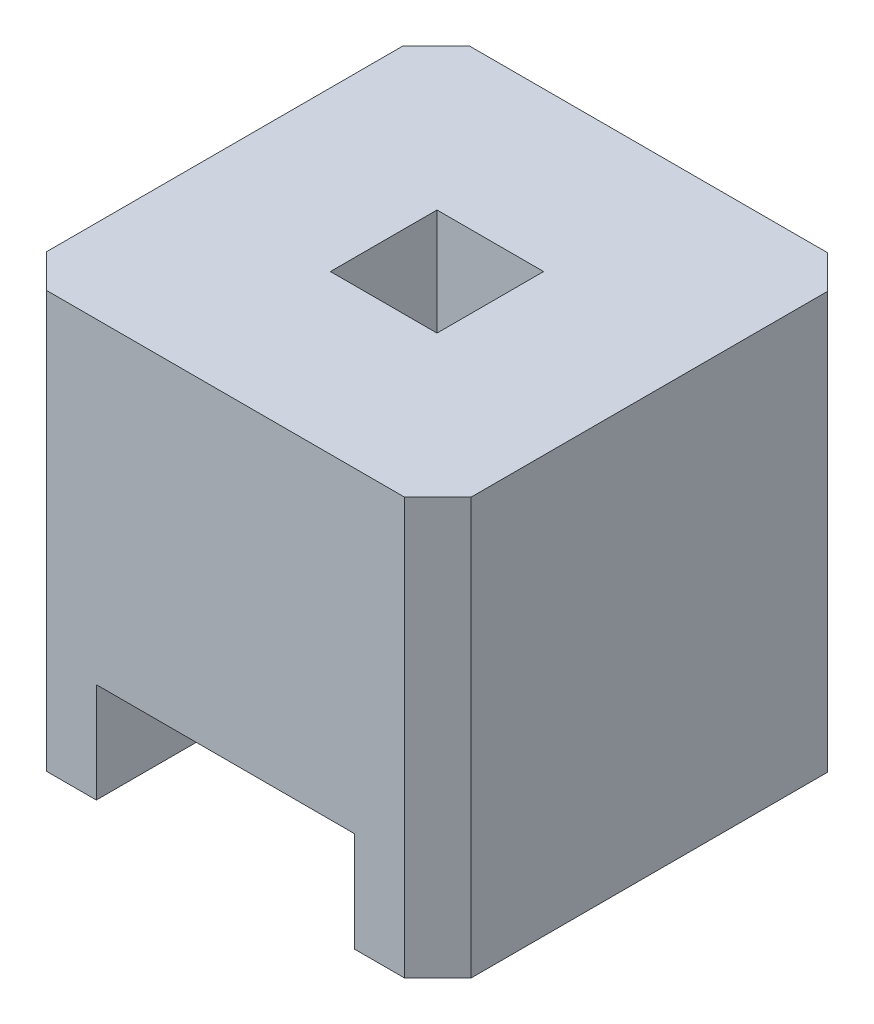
ISO-10303-21;
HEADER;
FILE_DESCRIPTION(('STEP AP214'),'2;1');
FILE_NAME('part.step','',(''),(''),'','','');
FILE_SCHEMA(('AUTOMOTIVE_DESIGN { 1 0 10303 214 1 1 1 1 }'));
ENDSEC;
DATA;
#1=APPLICATION_CONTEXT('core data for automotive mechanical design processes');
#2=APPLICATION_PROTOCOL_DEFINITION('international standard','automotive_design',2000,#1);
#3=PRODUCT_CONTEXT('',#1,'mechanical');
#4=PRODUCT('Part','Part','',(#3));
#5=PRODUCT_RELATED_PRODUCT_CATEGORY('part','',(#4));
#6=PRODUCT_DEFINITION_FORMATION('','',#4);
#7=PRODUCT_DEFINITION_CONTEXT('part definition',#1,'design');
#8=PRODUCT_DEFINITION('design','',#6,#7);
#9=PRODUCT_DEFINITION_SHAPE('','',#8);
#10=(LENGTH_UNIT() NAMED_UNIT(*) SI_UNIT(.MILLI.,.METRE.));
#11=(NAMED_UNIT(*) PLANE_ANGLE_UNIT() SI_UNIT($,.RADIAN.));
#12=(NAMED_UNIT(*) SI_UNIT($,.STERADIAN.) SOLID_ANGLE_UNIT());
#13=UNCERTAINTY_MEASURE_WITH_UNIT(LENGTH_MEASURE(1.E-05),#10,'distance_accuracy_value','');
#14=(GEOMETRIC_REPRESENTATION_CONTEXT(3) GLOBAL_UNCERTAINTY_ASSIGNED_CONTEXT((#13)) GLOBAL_UNIT_ASSIGNED_CONTEXT((#10,
#11,#12)) REPRESENTATION_CONTEXT('',''));
#15=CARTESIAN_POINT('',(0.,0.,0.));
#16=DIRECTION('',(0.,0.,1.));
#17=DIRECTION('',(1.,0.,0.));
#18=AXIS2_PLACEMENT_3D('',#15,#16,#17);
#19=CARTESIAN_POINT('',(0.32,1.25,0.32));
#20=DIRECTION('',(0.,0.,1.));
#21=DIRECTION('',(1.,0.,0.));
#22=AXIS2_PLACEMENT_3D('',#19,#20,#21);
#23=PLANE('',#22);
#24=DIRECTION('',(0.,-1.,0.));
#25=VECTOR('',#24,1.);
#26=CARTESIAN_POINT('',(-0.32,1.25,0.32));
#27=LINE('',#26,#25);
#28=CARTESIAN_POINT('',(-0.32,-0.65,0.32));
#29=VERTEX_POINT('',#28);
#30=CARTESIAN_POINT('',(-0.32,1.25,0.32));
#31=VERTEX_POINT('',#30);
#32=EDGE_CURVE('E171',#29,#31,#27,.F.);
#33=ORIENTED_EDGE('',*,*,#32,.T.);
#34=DIRECTION('',(1.,0.,0.));
#35=VECTOR('',#34,1.);
#36=CARTESIAN_POINT('',(0.32,1.25,0.32));
#37=LINE('',#36,#35);
#38=CARTESIAN_POINT('',(0.32,1.25,0.32));
#39=VERTEX_POINT('',#38);
#40=EDGE_CURVE('E20',#39,#31,#37,.F.);
#41=ORIENTED_EDGE('',*,*,#40,.F.);
#42=DIRECTION('',(0.,1.,0.));
#43=VECTOR('',#42,1.);
#44=CARTESIAN_POINT('',(0.32,1.25,0.32));
#45=LINE('',#44,#43);
#46=CARTESIAN_POINT('',(0.32,-0.65,0.32));
#47=VERTEX_POINT('',#46);
#48=EDGE_CURVE('E180',#39,#47,#45,.F.);
#49=ORIENTED_EDGE('',*,*,#48,.T.);
#50=DIRECTION('',(1.,0.,0.));
#51=VECTOR('',#50,1.);
#52=CARTESIAN_POINT('',(0.32,-0.65,0.32));
#53=LINE('',#52,#51);
#54=EDGE_CURVE('E158',#29,#47,#53,.T.);
#55=ORIENTED_EDGE('',*,*,#54,.F.);
#56=EDGE_LOOP('',(#33,#41,#49,#55));
#57=FACE_BOUND('',#56,.T.);
#58=ADVANCED_FACE('F17',(#57),#23,.F.);
#59=CARTESIAN_POINT('',(0.775,-0.65,0.));
#60=DIRECTION('',(-1.,0.,0.));
#61=DIRECTION('',(0.,0.,1.));
#62=AXIS2_PLACEMENT_3D('',#59,#60,#61);
#63=PLANE('',#62);
#64=DIRECTION('',(0.,0.,1.));
#65=VECTOR('',#64,1.);
#66=CARTESIAN_POINT('',(0.775,-0.65,0.));
#67=LINE('',#66,#65);
#68=CARTESIAN_POINT('',(0.775,-0.65,-1.27));
#69=VERTEX_POINT('',#68);
#70=CARTESIAN_POINT('',(0.775,-0.65,1.27));
#71=VERTEX_POINT('',#70);
#72=EDGE_CURVE('E238',#69,#71,#67,.T.);
#73=ORIENTED_EDGE('',*,*,#72,.F.);
#74=DIRECTION('',(0.,1.,0.));
#75=VECTOR('',#74,1.);
#76=CARTESIAN_POINT('',(0.775,-0.65,-1.27));
#77=LINE('',#76,#75);
#78=CARTESIAN_POINT('',(0.775,-1.25,-1.27));
#79=VERTEX_POINT('',#78);
#80=EDGE_CURVE('E155',#69,#79,#77,.F.);
#81=ORIENTED_EDGE('',*,*,#80,.T.);
#82=DIRECTION('',(0.,0.,-1.));
#83=VECTOR('',#82,1.);
#84=CARTESIAN_POINT('',(0.775,-1.25,0.));
#85=LINE('',#84,#83);
#86=CARTESIAN_POINT('',(0.775,-1.25,1.27));
#87=VERTEX_POINT('',#86);
#88=EDGE_CURVE('E193',#87,#79,#85,.T.);
#89=ORIENTED_EDGE('',*,*,#88,.F.);
#90=DIRECTION('',(0.,1.,0.));
#91=VECTOR('',#90,1.);
#92=CARTESIAN_POINT('',(0.775,-0.65,1.27));
#93=LINE('',#92,#91);
#94=EDGE_CURVE('E157',#87,#71,#93,.T.);
#95=ORIENTED_EDGE('',*,*,#94,.T.);
#96=EDGE_LOOP('',(#73,#81,#89,#95));
#97=FACE_BOUND('',#96,.T.);
#98=ADVANCED_FACE('F329',(#97),#63,.T.);
#99=CARTESIAN_POINT('',(-0.775,-1.25,0.));
#100=DIRECTION('',(1.,0.,0.));
#101=DIRECTION('',(0.,1.,0.));
#102=AXIS2_PLACEMENT_3D('',#99,#100,#101);
#103=PLANE('',#102);
#104=DIRECTION('',(0.,0.,-1.));
#105=VECTOR('',#104,1.);
#106=CARTESIAN_POINT('',(-0.775,-1.25,0.));
#107=LINE('',#106,#105);
#108=CARTESIAN_POINT('',(-0.775,-1.25,-1.27));
#109=VERTEX_POINT('',#108);
#110=CARTESIAN_POINT('',(-0.775,-1.25,1.27));
#111=VERTEX_POINT('',#110);
#112=EDGE_CURVE('E142',#109,#111,#107,.F.);
#113=ORIENTED_EDGE('',*,*,#112,.F.);
#114=DIRECTION('',(0.,1.,0.));
#115=VECTOR('',#114,1.);
#116=CARTESIAN_POINT('',(-0.775,-1.25,-1.27));
#117=LINE('',#116,#115);
#118=CARTESIAN_POINT('',(-0.775,-0.65,-1.27));
#119=VERTEX_POINT('',#118);
#120=EDGE_CURVE('E131',#109,#119,#117,.T.);
#121=ORIENTED_EDGE('',*,*,#120,.T.);
#122=DIRECTION('',(0.,0.,1.));
#123=VECTOR('',#122,1.);
#124=CARTESIAN_POINT('',(-0.775,-0.65,0.));
#125=LINE('',#124,#123);
#126=CARTESIAN_POINT('',(-0.775,-0.65,1.27));
#127=VERTEX_POINT('',#126);
#128=EDGE_CURVE('E236',#127,#119,#125,.F.);
#129=ORIENTED_EDGE('',*,*,#128,.F.);
#130=DIRECTION('',(0.,1.,0.));
#131=VECTOR('',#130,1.);
#132=CARTESIAN_POINT('',(-0.775,-1.25,1.27));
#133=LINE('',#132,#131);
#134=EDGE_CURVE('E126',#127,#111,#133,.F.);
#135=ORIENTED_EDGE('',*,*,#134,.T.);
#136=EDGE_LOOP('',(#113,#121,#129,#135));
#137=FACE_BOUND('',#136,.T.);
#138=ADVANCED_FACE('F143',(#137),#103,.T.);
#139=CARTESIAN_POINT('',(-1.275,-1.25,0.));
#140=DIRECTION('',(0.,-1.,0.));
#141=DIRECTION('',(0.,0.,-1.));
#142=AXIS2_PLACEMENT_3D('',#139,#140,#141);
#143=PLANE('',#142);
#144=DIRECTION('',(0.707106781186548,0.,0.707106781186548));
#145=VECTOR('',#144,1.);
#146=CARTESIAN_POINT('',(-1.175,-1.25,1.17));
#147=LINE('',#146,#145);
#148=CARTESIAN_POINT('',(-1.275,-1.25,1.07));
#149=VERTEX_POINT('',#148);
#150=CARTESIAN_POINT('',(-1.075,-1.25,1.27));
#151=VERTEX_POINT('',#150);
#152=EDGE_CURVE('E202',#149,#151,#147,.T.);
#153=ORIENTED_EDGE('',*,*,#152,.F.);
#154=DIRECTION('',(0.,0.,1.));
#155=VECTOR('',#154,1.);
#156=CARTESIAN_POINT('',(-1.275,-1.25,0.));
#157=LINE('',#156,#155);
#158=CARTESIAN_POINT('',(-1.275,-1.25,-1.07));
#159=VERTEX_POINT('',#158);
#160=EDGE_CURVE('E224',#159,#149,#157,.T.);
#161=ORIENTED_EDGE('',*,*,#160,.F.);
#162=DIRECTION('',(-0.707106781186548,0.,0.707106781186548));
#163=VECTOR('',#162,1.);
#164=CARTESIAN_POINT('',(-1.175,-1.25,-1.17));
#165=LINE('',#164,#163);
#166=CARTESIAN_POINT('',(-1.075,-1.25,-1.27));
#167=VERTEX_POINT('',#166);
#168=EDGE_CURVE('E149',#167,#159,#165,.T.);
#169=ORIENTED_EDGE('',*,*,#168,.F.);
#170=DIRECTION('',(1.,0.,0.));
#171=VECTOR('',#170,1.);
#172=CARTESIAN_POINT('',(-1.275,-1.25,-1.27));
#173=LINE('',#172,#171);
#174=EDGE_CURVE('E135',#167,#109,#173,.T.);
#175=ORIENTED_EDGE('',*,*,#174,.T.);
#176=ORIENTED_EDGE('',*,*,#112,.T.);
#177=DIRECTION('',(1.,0.,0.));
#178=VECTOR('',#177,1.);
#179=CARTESIAN_POINT('',(-1.275,-1.25,1.27));
#180=LINE('',#179,#178);
#181=EDGE_CURVE('E145',#111,#151,#180,.F.);
#182=ORIENTED_EDGE('',*,*,#181,.T.);
#183=EDGE_LOOP('',(#153,#161,#169,#175,#176,#182));
#184=FACE_BOUND('',#183,.T.);
#185=ADVANCED_FACE('F147',(#184),#143,.T.);
#186=CARTESIAN_POINT('',(-1.175,0.625,1.17));
#187=DIRECTION('',(-0.707106781186548,0.,0.707106781186548));
#188=DIRECTION('',(0.707106781186548,0.,0.707106781186548));
#189=AXIS2_PLACEMENT_3D('',#186,#187,#188);
#190=PLANE('',#189);
#191=DIRECTION('',(0.707106781186548,0.,0.707106781186548));
#192=VECTOR('',#191,1.);
#193=CARTESIAN_POINT('',(-1.175,1.25,1.17));
#194=LINE('',#193,#192);
#195=CARTESIAN_POINT('',(-1.075,1.25,1.27));
#196=VERTEX_POINT('',#195);
#197=CARTESIAN_POINT('',(-1.275,1.25,1.07));
#198=VERTEX_POINT('',#197);
#199=EDGE_CURVE('E200',#196,#198,#194,.F.);
#200=ORIENTED_EDGE('',*,*,#199,.T.);
#201=DIRECTION('',(0.,1.,0.));
#202=VECTOR('',#201,1.);
#203=CARTESIAN_POINT('',(-1.275,1.25,1.07));
#204=LINE('',#203,#202);
#205=EDGE_CURVE('E213',#149,#198,#204,.T.);
#206=ORIENTED_EDGE('',*,*,#205,.F.);
#207=ORIENTED_EDGE('',*,*,#152,.T.);
#208=DIRECTION('',(0.,1.,0.));
#209=VECTOR('',#208,1.);
#210=CARTESIAN_POINT('',(-1.075,0.,1.27));
#211=LINE('',#210,#209);
#212=EDGE_CURVE('E210',#196,#151,#211,.F.);
#213=ORIENTED_EDGE('',*,*,#212,.F.);
#214=EDGE_LOOP('',(#200,#206,#207,#213));
#215=FACE_BOUND('',#214,.T.);
#216=ADVANCED_FACE('F209',(#215),#190,.T.);
#217=CARTESIAN_POINT('',(1.175,-0.625,1.17));
#218=DIRECTION('',(0.707106781186548,0.,0.707106781186547));
#219=DIRECTION('',(0.707106781186547,0.,-0.707106781186548));
#220=AXIS2_PLACEMENT_3D('',#217,#218,#219);
#221=PLANE('',#220);
#222=DIRECTION('',(-0.707106781186548,0.,0.707106781186548));
#223=VECTOR('',#222,1.);
#224=CARTESIAN_POINT('',(1.275,-1.25,1.07));
#225=LINE('',#224,#223);
#226=CARTESIAN_POINT('',(1.275,-1.25,1.07));
#227=VERTEX_POINT('',#226);
#228=CARTESIAN_POINT('',(1.075,-1.25,1.27));
#229=VERTEX_POINT('',#228);
#230=EDGE_CURVE('E196',#227,#229,#225,.T.);
#231=ORIENTED_EDGE('',*,*,#230,.F.);
#232=DIRECTION('',(0.,1.,0.));
#233=VECTOR('',#232,1.);
#234=CARTESIAN_POINT('',(1.275,-1.25,1.07));
#235=LINE('',#234,#233);
#236=CARTESIAN_POINT('',(1.275,1.25,1.07));
#237=VERTEX_POINT('',#236);
#238=EDGE_CURVE('E269',#237,#227,#235,.F.);
#239=ORIENTED_EDGE('',*,*,#238,.F.);
#240=DIRECTION('',(0.707106781186547,0.,-0.707106781186548));
#241=VECTOR('',#240,1.);
#242=CARTESIAN_POINT('',(1.175,1.25,1.17));
#243=LINE('',#242,#241);
#244=CARTESIAN_POINT('',(1.075,1.25,1.27));
#245=VERTEX_POINT('',#244);
#246=EDGE_CURVE('E198',#237,#245,#243,.F.);
#247=ORIENTED_EDGE('',*,*,#246,.T.);
#248=DIRECTION('',(0.,1.,0.));
#249=VECTOR('',#248,1.);
#250=CARTESIAN_POINT('',(1.075,0.,1.27));
#251=LINE('',#250,#249);
#252=EDGE_CURVE('E275',#229,#245,#251,.T.);
#253=ORIENTED_EDGE('',*,*,#252,.F.);
#254=EDGE_LOOP('',(#231,#239,#247,#253));
#255=FACE_BOUND('',#254,.T.);
#256=ADVANCED_FACE('F285',(#255),#221,.T.);
#257=CARTESIAN_POINT('',(0.775,-1.25,0.));
#258=DIRECTION('',(0.,-1.,0.));
#259=DIRECTION('',(0.,0.,-1.));
#260=AXIS2_PLACEMENT_3D('',#257,#258,#259);
#261=PLANE('',#260);
#262=ORIENTED_EDGE('',*,*,#88,.T.);
#263=DIRECTION('',(1.,0.,0.));
#264=VECTOR('',#263,1.);
#265=CARTESIAN_POINT('',(0.775,-1.25,-1.27));
#266=LINE('',#265,#264);
#267=CARTESIAN_POINT('',(1.075,-1.25,-1.27));
#268=VERTEX_POINT('',#267);
#269=EDGE_CURVE('E191',#79,#268,#266,.T.);
#270=ORIENTED_EDGE('',*,*,#269,.T.);
#271=DIRECTION('',(-0.707106781186547,0.,-0.707106781186548));
#272=VECTOR('',#271,1.);
#273=CARTESIAN_POINT('',(1.175,-1.25,-1.17));
#274=LINE('',#273,#272);
#275=CARTESIAN_POINT('',(1.275,-1.25,-1.07));
#276=VERTEX_POINT('',#275);
#277=EDGE_CURVE('E185',#276,#268,#274,.T.);
#278=ORIENTED_EDGE('',*,*,#277,.F.);
#279=DIRECTION('',(0.,0.,1.));
#280=VECTOR('',#279,1.);
#281=CARTESIAN_POINT('',(1.275,-1.25,0.));
#282=LINE('',#281,#280);
#283=EDGE_CURVE('E266',#227,#276,#282,.F.);
#284=ORIENTED_EDGE('',*,*,#283,.F.);
#285=ORIENTED_EDGE('',*,*,#230,.T.);
#286=DIRECTION('',(1.,0.,0.));
#287=VECTOR('',#286,1.);
#288=CARTESIAN_POINT('',(0.,-1.25,1.27));
#289=LINE('',#288,#287);
#290=EDGE_CURVE('E222',#87,#229,#289,.T.);
#291=ORIENTED_EDGE('',*,*,#290,.F.);
#292=EDGE_LOOP('',(#262,#270,#278,#284,#285,#291));
#293=FACE_BOUND('',#292,.T.);
#294=ADVANCED_FACE('F281',(#293),#261,.T.);
#295=CARTESIAN_POINT('',(-1.175,0.625,-1.17));
#296=DIRECTION('',(-0.707106781186548,0.,-0.707106781186548));
#297=DIRECTION('',(-0.707106781186548,0.,0.707106781186548));
#298=AXIS2_PLACEMENT_3D('',#295,#296,#297);
#299=PLANE('',#298);
#300=ORIENTED_EDGE('',*,*,#168,.T.);
#301=DIRECTION('',(0.,1.,0.));
#302=VECTOR('',#301,1.);
#303=CARTESIAN_POINT('',(-1.275,1.25,-1.07));
#304=LINE('',#303,#302);
#305=CARTESIAN_POINT('',(-1.275,1.25,-1.07));
#306=VERTEX_POINT('',#305);
#307=EDGE_CURVE('E229',#306,#159,#304,.F.);
#308=ORIENTED_EDGE('',*,*,#307,.F.);
#309=DIRECTION('',(-0.707106781186548,0.,0.707106781186548));
#310=VECTOR('',#309,1.);
#311=CARTESIAN_POINT('',(-1.175,1.25,-1.17));
#312=LINE('',#311,#310);
#313=CARTESIAN_POINT('',(-1.075,1.25,-1.27));
#314=VERTEX_POINT('',#313);
#315=EDGE_CURVE('E189',#306,#314,#312,.F.);
#316=ORIENTED_EDGE('',*,*,#315,.T.);
#317=DIRECTION('',(0.,1.,0.));
#318=VECTOR('',#317,1.);
#319=CARTESIAN_POINT('',(-1.075,0.,-1.27));
#320=LINE('',#319,#318);
#321=EDGE_CURVE('E264',#167,#314,#320,.T.);
#322=ORIENTED_EDGE('',*,*,#321,.F.);
#323=EDGE_LOOP('',(#300,#308,#316,#322));
#324=FACE_BOUND('',#323,.T.);
#325=ADVANCED_FACE('F297',(#324),#299,.T.);
#326=CARTESIAN_POINT('',(1.175,-0.625,-1.17));
#327=DIRECTION('',(0.707106781186548,0.,-0.707106781186547));
#328=DIRECTION('',(-0.707106781186547,0.,-0.707106781186548));
#329=AXIS2_PLACEMENT_3D('',#326,#327,#328);
#330=PLANE('',#329);
#331=DIRECTION('',(-0.707106781186547,0.,-0.707106781186548));
#332=VECTOR('',#331,1.);
#333=CARTESIAN_POINT('',(1.175,1.25,-1.17));
#334=LINE('',#333,#332);
#335=CARTESIAN_POINT('',(1.075,1.25,-1.27));
#336=VERTEX_POINT('',#335);
#337=CARTESIAN_POINT('',(1.275,1.25,-1.07));
#338=VERTEX_POINT('',#337);
#339=EDGE_CURVE('E173',#336,#338,#334,.F.);
#340=ORIENTED_EDGE('',*,*,#339,.T.);
#341=DIRECTION('',(0.,1.,0.));
#342=VECTOR('',#341,1.);
#343=CARTESIAN_POINT('',(1.275,-1.25,-1.07));
#344=LINE('',#343,#342);
#345=EDGE_CURVE('E272',#276,#338,#344,.T.);
#346=ORIENTED_EDGE('',*,*,#345,.F.);
#347=ORIENTED_EDGE('',*,*,#277,.T.);
#348=DIRECTION('',(0.,1.,0.));
#349=VECTOR('',#348,1.);
#350=CARTESIAN_POINT('',(1.075,0.,-1.27));
#351=LINE('',#350,#349);
#352=EDGE_CURVE('E261',#336,#268,#351,.F.);
#353=ORIENTED_EDGE('',*,*,#352,.F.);
#354=EDGE_LOOP('',(#340,#346,#347,#353));
#355=FACE_BOUND('',#354,.T.);
#356=ADVANCED_FACE('F326',(#355),#330,.T.);
#357=CARTESIAN_POINT('',(-0.32,1.25,0.32));
#358=DIRECTION('',(-1.,0.,0.));
#359=DIRECTION('',(0.,-1.,0.));
#360=AXIS2_PLACEMENT_3D('',#357,#358,#359);
#361=PLANE('',#360);
#362=DIRECTION('',(0.,1.,0.));
#363=VECTOR('',#362,1.);
#364=CARTESIAN_POINT('',(-0.32,1.25,-0.32));
#365=LINE('',#364,#363);
#366=CARTESIAN_POINT('',(-0.32,-0.65,-0.32));
#367=VERTEX_POINT('',#366);
#368=CARTESIAN_POINT('',(-0.32,1.25,-0.32));
#369=VERTEX_POINT('',#368);
#370=EDGE_CURVE('E177',#367,#369,#365,.T.);
#371=ORIENTED_EDGE('',*,*,#370,.T.);
#372=DIRECTION('',(0.,0.,1.));
#373=VECTOR('',#372,1.);
#374=CARTESIAN_POINT('',(-0.32,1.25,0.32));
#375=LINE('',#374,#373);
#376=EDGE_CURVE('E34',#31,#369,#375,.F.);
#377=ORIENTED_EDGE('',*,*,#376,.F.);
#378=ORIENTED_EDGE('',*,*,#32,.F.);
#379=DIRECTION('',(0.,0.,1.));
#380=VECTOR('',#379,1.);
#381=CARTESIAN_POINT('',(-0.32,-0.65,0.));
#382=LINE('',#381,#380);
#383=EDGE_CURVE('E232',#367,#29,#382,.T.);
#384=ORIENTED_EDGE('',*,*,#383,.F.);
#385=EDGE_LOOP('',(#371,#377,#378,#384));
#386=FACE_BOUND('',#385,.T.);
#387=ADVANCED_FACE('F175',(#386),#361,.F.);
#388=CARTESIAN_POINT('',(0.32,1.25,-0.32));
#389=DIRECTION('',(1.,0.,0.));
#390=DIRECTION('',(0.,1.,0.));
#391=AXIS2_PLACEMENT_3D('',#388,#389,#390);
#392=PLANE('',#391);
#393=ORIENTED_EDGE('',*,*,#48,.F.);
#394=DIRECTION('',(0.,0.,1.));
#395=VECTOR('',#394,1.);
#396=CARTESIAN_POINT('',(0.32,1.25,-0.32));
#397=LINE('',#396,#395);
#398=CARTESIAN_POINT('',(0.32,1.25,-0.32));
#399=VERTEX_POINT('',#398);
#400=EDGE_CURVE('E167',#399,#39,#397,.T.);
#401=ORIENTED_EDGE('',*,*,#400,.F.);
#402=DIRECTION('',(0.,1.,0.));
#403=VECTOR('',#402,1.);
#404=CARTESIAN_POINT('',(0.32,1.25,-0.32));
#405=LINE('',#404,#403);
#406=CARTESIAN_POINT('',(0.32,-0.65,-0.32));
#407=VERTEX_POINT('',#406);
#408=EDGE_CURVE('E244',#399,#407,#405,.F.);
#409=ORIENTED_EDGE('',*,*,#408,.T.);
#410=DIRECTION('',(0.,0.,1.));
#411=VECTOR('',#410,1.);
#412=CARTESIAN_POINT('',(0.32,-0.65,0.));
#413=LINE('',#412,#411);
#414=EDGE_CURVE('E234',#47,#407,#413,.F.);
#415=ORIENTED_EDGE('',*,*,#414,.F.);
#416=EDGE_LOOP('',(#393,#401,#409,#415));
#417=FACE_BOUND('',#416,.T.);
#418=ADVANCED_FACE('F242',(#417),#392,.F.);
#419=CARTESIAN_POINT('',(-0.775,-0.65,0.));
#420=DIRECTION('',(0.,-1.,0.));
#421=DIRECTION('',(1.,0.,0.));
#422=AXIS2_PLACEMENT_3D('',#419,#420,#421);
#423=PLANE('',#422);
#424=ORIENTED_EDGE('',*,*,#383,.T.);
#425=ORIENTED_EDGE('',*,*,#54,.T.);
#426=ORIENTED_EDGE('',*,*,#414,.T.);
#427=DIRECTION('',(-1.,0.,0.));
#428=VECTOR('',#427,1.);
#429=CARTESIAN_POINT('',(-0.32,-0.65,-0.32));
#430=LINE('',#429,#428);
#431=EDGE_CURVE('E249',#407,#367,#430,.T.);
#432=ORIENTED_EDGE('',*,*,#431,.T.);
#433=EDGE_LOOP('',(#424,#425,#426,#432));
#434=FACE_BOUND('',#433,.T.);
#435=ORIENTED_EDGE('',*,*,#128,.T.);
#436=DIRECTION('',(-1.,0.,0.));
#437=VECTOR('',#436,1.);
#438=CARTESIAN_POINT('',(0.,-0.65,-1.27));
#439=LINE('',#438,#437);
#440=EDGE_CURVE('E138',#69,#119,#439,.T.);
#441=ORIENTED_EDGE('',*,*,#440,.F.);
#442=ORIENTED_EDGE('',*,*,#72,.T.);
#443=DIRECTION('',(1.,0.,0.));
#444=VECTOR('',#443,1.);
#445=CARTESIAN_POINT('',(0.,-0.65,1.27));
#446=LINE('',#445,#444);
#447=EDGE_CURVE('E219',#127,#71,#446,.T.);
#448=ORIENTED_EDGE('',*,*,#447,.F.);
#449=EDGE_LOOP('',(#435,#441,#442,#448));
#450=FACE_BOUND('',#449,.T.);
#451=ADVANCED_FACE('F247',(#434,#450),#423,.T.);
#452=CARTESIAN_POINT('',(-1.275,1.25,0.));
#453=DIRECTION('',(-1.,0.,0.));
#454=DIRECTION('',(0.,0.,1.));
#455=AXIS2_PLACEMENT_3D('',#452,#453,#454);
#456=PLANE('',#455);
#457=ORIENTED_EDGE('',*,*,#205,.T.);
#458=DIRECTION('',(0.,0.,1.));
#459=VECTOR('',#458,1.);
#460=CARTESIAN_POINT('',(-1.275,1.25,0.));
#461=LINE('',#460,#459);
#462=EDGE_CURVE('E252',#306,#198,#461,.T.);
#463=ORIENTED_EDGE('',*,*,#462,.F.);
#464=ORIENTED_EDGE('',*,*,#307,.T.);
#465=ORIENTED_EDGE('',*,*,#160,.T.);
#466=EDGE_LOOP('',(#457,#463,#464,#465));
#467=FACE_BOUND('',#466,.T.);
#468=ADVANCED_FACE('F300',(#467),#456,.T.);
#469=CARTESIAN_POINT('',(0.,0.,1.27));
#470=DIRECTION('',(0.,0.,1.));
#471=DIRECTION('',(1.,0.,0.));
#472=AXIS2_PLACEMENT_3D('',#469,#470,#471);
#473=PLANE('',#472);
#474=ORIENTED_EDGE('',*,*,#252,.T.);
#475=DIRECTION('',(-1.,0.,0.));
#476=VECTOR('',#475,1.);
#477=CARTESIAN_POINT('',(1.275,1.25,1.27));
#478=LINE('',#477,#476);
#479=EDGE_CURVE('E218',#196,#245,#478,.F.);
#480=ORIENTED_EDGE('',*,*,#479,.F.);
#481=ORIENTED_EDGE('',*,*,#212,.T.);
#482=ORIENTED_EDGE('',*,*,#181,.F.);
#483=ORIENTED_EDGE('',*,*,#134,.F.);
#484=ORIENTED_EDGE('',*,*,#447,.T.);
#485=ORIENTED_EDGE('',*,*,#94,.F.);
#486=ORIENTED_EDGE('',*,*,#290,.T.);
#487=EDGE_LOOP('',(#474,#480,#481,#482,#483,#484,#485,#486));
#488=FACE_BOUND('',#487,.T.);
#489=ADVANCED_FACE('F216',(#488),#473,.T.);
#490=CARTESIAN_POINT('',(1.275,-1.25,0.));
#491=DIRECTION('',(1.,0.,0.));
#492=DIRECTION('',(0.,1.,0.));
#493=AXIS2_PLACEMENT_3D('',#490,#491,#492);
#494=PLANE('',#493);
#495=ORIENTED_EDGE('',*,*,#238,.T.);
#496=ORIENTED_EDGE('',*,*,#283,.T.);
#497=ORIENTED_EDGE('',*,*,#345,.T.);
#498=DIRECTION('',(0.,0.,1.));
#499=VECTOR('',#498,1.);
#500=CARTESIAN_POINT('',(1.275,1.25,0.));
#501=LINE('',#500,#499);
#502=EDGE_CURVE('E288',#237,#338,#501,.F.);
#503=ORIENTED_EDGE('',*,*,#502,.F.);
#504=EDGE_LOOP('',(#495,#496,#497,#503));
#505=FACE_BOUND('',#504,.T.);
#506=ADVANCED_FACE('F308',(#505),#494,.T.);
#507=CARTESIAN_POINT('',(0.,0.,-1.27));
#508=DIRECTION('',(0.,0.,-1.));
#509=DIRECTION('',(-1.,0.,0.));
#510=AXIS2_PLACEMENT_3D('',#507,#508,#509);
#511=PLANE('',#510);
#512=ORIENTED_EDGE('',*,*,#120,.F.);
#513=ORIENTED_EDGE('',*,*,#174,.F.);
#514=ORIENTED_EDGE('',*,*,#321,.T.);
#515=DIRECTION('',(-1.,0.,0.));
#516=VECTOR('',#515,1.);
#517=CARTESIAN_POINT('',(1.275,1.25,-1.27));
#518=LINE('',#517,#516);
#519=EDGE_CURVE('E26',#336,#314,#518,.T.);
#520=ORIENTED_EDGE('',*,*,#519,.F.);
#521=ORIENTED_EDGE('',*,*,#352,.T.);
#522=ORIENTED_EDGE('',*,*,#269,.F.);
#523=ORIENTED_EDGE('',*,*,#80,.F.);
#524=ORIENTED_EDGE('',*,*,#440,.T.);
#525=EDGE_LOOP('',(#512,#513,#514,#520,#521,#522,#523,#524));
#526=FACE_BOUND('',#525,.T.);
#527=ADVANCED_FACE('F132',(#526),#511,.T.);
#528=CARTESIAN_POINT('',(-0.32,1.25,-0.32));
#529=DIRECTION('',(0.,0.,-1.));
#530=DIRECTION('',(-1.,0.,0.));
#531=AXIS2_PLACEMENT_3D('',#528,#529,#530);
#532=PLANE('',#531);
#533=ORIENTED_EDGE('',*,*,#408,.F.);
#534=DIRECTION('',(-1.,0.,0.));
#535=VECTOR('',#534,1.);
#536=CARTESIAN_POINT('',(1.275,1.25,-0.32));
#537=LINE('',#536,#535);
#538=EDGE_CURVE('E11',#369,#399,#537,.F.);
#539=ORIENTED_EDGE('',*,*,#538,.F.);
#540=ORIENTED_EDGE('',*,*,#370,.F.);
#541=ORIENTED_EDGE('',*,*,#431,.F.);
#542=EDGE_LOOP('',(#533,#539,#540,#541));
#543=FACE_BOUND('',#542,.T.);
#544=ADVANCED_FACE('F251',(#543),#532,.F.);
#545=CARTESIAN_POINT('',(1.275,1.25,0.));
#546=DIRECTION('',(0.,1.,0.));
#547=DIRECTION('',(-1.,0.,0.));
#548=AXIS2_PLACEMENT_3D('',#545,#546,#547);
#549=PLANE('',#548);
#550=ORIENTED_EDGE('',*,*,#376,.T.);
#551=ORIENTED_EDGE('',*,*,#538,.T.);
#552=ORIENTED_EDGE('',*,*,#400,.T.);
#553=ORIENTED_EDGE('',*,*,#40,.T.);
#554=EDGE_LOOP('',(#550,#551,#552,#553));
#555=FACE_BOUND('',#554,.T.);
#556=ORIENTED_EDGE('',*,*,#339,.F.);
#557=ORIENTED_EDGE('',*,*,#519,.T.);
#558=ORIENTED_EDGE('',*,*,#315,.F.);
#559=ORIENTED_EDGE('',*,*,#462,.T.);
#560=ORIENTED_EDGE('',*,*,#199,.F.);
#561=ORIENTED_EDGE('',*,*,#479,.T.);
#562=ORIENTED_EDGE('',*,*,#246,.F.);
#563=ORIENTED_EDGE('',*,*,#502,.T.);
#564=EDGE_LOOP('',(#556,#557,#558,#559,#560,#561,#562,#563));
#565=FACE_BOUND('',#564,.T.);
#566=ADVANCED_FACE('F165',(#555,#565),#549,.T.);
#567=CLOSED_SHELL('',(#58,#98,#138,#185,#216,#256,#294,#325,#356,#387,#418,#451,#468,#489,#506,
#527,#544,#566));
#568=MANIFOLD_SOLID_BREP('B1',#567);
#569=ADVANCED_BREP_SHAPE_REPRESENTATION('',(#18,#568),#14);
#570=SHAPE_DEFINITION_REPRESENTATION(#9,#569);
ENDSEC;
END-ISO-10303-21;
